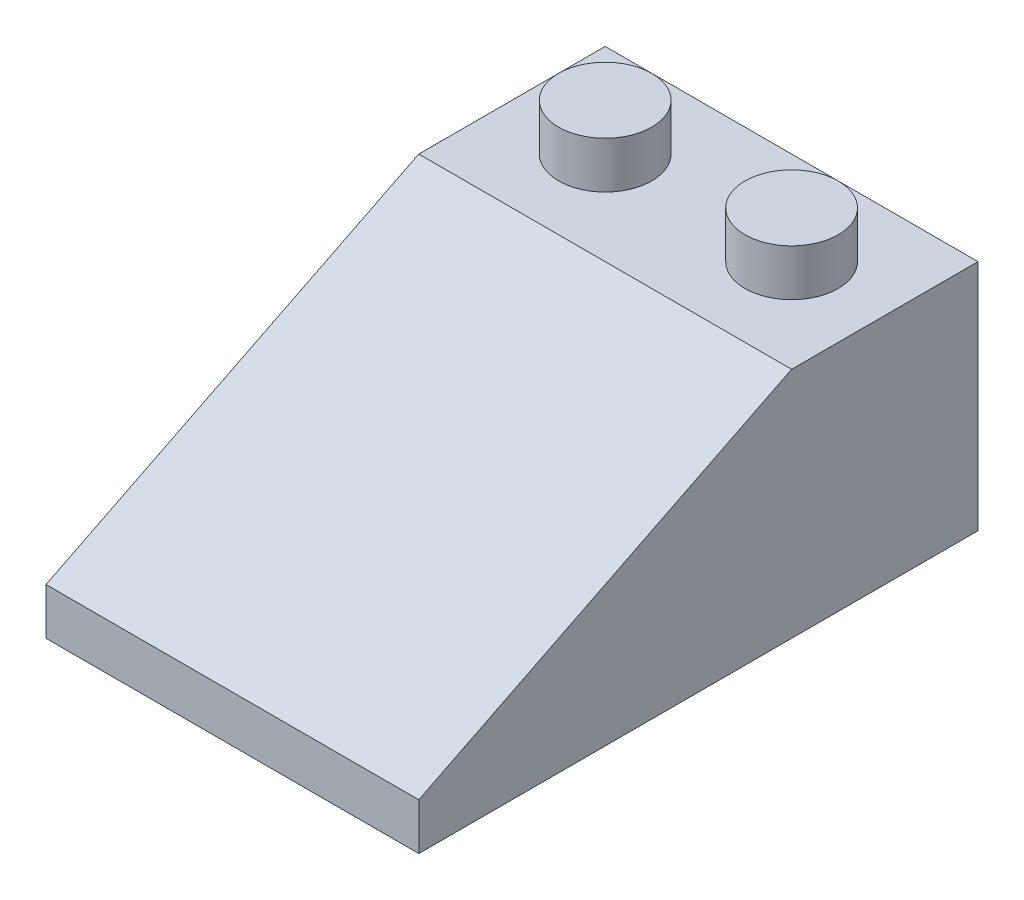
ISO-10303-21;
HEADER;
FILE_DESCRIPTION(('STEP AP214'),'2;1');
FILE_NAME('part.step','',(''),(''),'','','');
FILE_SCHEMA(('AUTOMOTIVE_DESIGN { 1 0 10303 214 1 1 1 1 }'));
ENDSEC;
DATA;
#1=APPLICATION_CONTEXT('core data for automotive mechanical design processes');
#2=APPLICATION_PROTOCOL_DEFINITION('international standard','automotive_design',2000,#1);
#3=PRODUCT_CONTEXT('',#1,'mechanical');
#4=PRODUCT('Part','Part','',(#3));
#5=PRODUCT_RELATED_PRODUCT_CATEGORY('part','',(#4));
#6=PRODUCT_DEFINITION_FORMATION('','',#4);
#7=PRODUCT_DEFINITION_CONTEXT('part definition',#1,'design');
#8=PRODUCT_DEFINITION('design','',#6,#7);
#9=PRODUCT_DEFINITION_SHAPE('','',#8);
#10=(LENGTH_UNIT() NAMED_UNIT(*) SI_UNIT(.MILLI.,.METRE.));
#11=(NAMED_UNIT(*) PLANE_ANGLE_UNIT() SI_UNIT($,.RADIAN.));
#12=(NAMED_UNIT(*) SI_UNIT($,.STERADIAN.) SOLID_ANGLE_UNIT());
#13=UNCERTAINTY_MEASURE_WITH_UNIT(LENGTH_MEASURE(1.E-05),#10,'distance_accuracy_value','');
#14=(GEOMETRIC_REPRESENTATION_CONTEXT(3) GLOBAL_UNCERTAINTY_ASSIGNED_CONTEXT((#13)) GLOBAL_UNIT_ASSIGNED_CONTEXT((#10,
#11,#12)) REPRESENTATION_CONTEXT('',''));
#15=CARTESIAN_POINT('',(0.,0.,0.));
#16=DIRECTION('',(0.,0.,1.));
#17=DIRECTION('',(1.,0.,0.));
#18=AXIS2_PLACEMENT_3D('',#15,#16,#17);
#19=CARTESIAN_POINT('',(16.,-5.,-12.));
#20=DIRECTION('',(0.,1.,0.));
#21=DIRECTION('',(0.,0.,1.));
#22=AXIS2_PLACEMENT_3D('',#19,#20,#21);
#23=PLANE('',#22);
#24=DIRECTION('',(0.,0.,-1.));
#25=VECTOR('',#24,1.);
#26=CARTESIAN_POINT('',(0.,-5.,-12.));
#27=LINE('',#26,#25);
#28=CARTESIAN_POINT('',(0.,-5.,12.));
#29=VERTEX_POINT('',#28);
#30=CARTESIAN_POINT('',(0.,-5.,-12.));
#31=VERTEX_POINT('',#30);
#32=EDGE_CURVE('E298',#29,#31,#27,.T.);
#33=ORIENTED_EDGE('',*,*,#32,.T.);
#34=DIRECTION('',(-1.,0.,0.));
#35=VECTOR('',#34,1.);
#36=CARTESIAN_POINT('',(16.,-5.,-12.));
#37=LINE('',#36,#35);
#38=CARTESIAN_POINT('',(16.,-5.,-12.));
#39=VERTEX_POINT('',#38);
#40=EDGE_CURVE('E310',#39,#31,#37,.T.);
#41=ORIENTED_EDGE('',*,*,#40,.F.);
#42=DIRECTION('',(0.,0.,-1.));
#43=VECTOR('',#42,1.);
#44=CARTESIAN_POINT('',(16.,-5.,-12.));
#45=LINE('',#44,#43);
#46=CARTESIAN_POINT('',(16.,-5.,12.));
#47=VERTEX_POINT('',#46);
#48=EDGE_CURVE('E284',#47,#39,#45,.T.);
#49=ORIENTED_EDGE('',*,*,#48,.F.);
#50=DIRECTION('',(-1.,0.,0.));
#51=VECTOR('',#50,1.);
#52=CARTESIAN_POINT('',(16.,-5.,12.));
#53=LINE('',#52,#51);
#54=EDGE_CURVE('E314',#47,#29,#53,.T.);
#55=ORIENTED_EDGE('',*,*,#54,.T.);
#56=EDGE_LOOP('',(#33,#41,#49,#55));
#57=FACE_BOUND('',#56,.T.);
#58=DIRECTION('',(0.,0.,-1.));
#59=VECTOR('',#58,1.);
#60=CARTESIAN_POINT('',(1.,-5.,-12.));
#61=LINE('',#60,#59);
#62=CARTESIAN_POINT('',(1.,-5.,11.));
#63=VERTEX_POINT('',#62);
#64=CARTESIAN_POINT('',(1.,-5.,-11.));
#65=VERTEX_POINT('',#64);
#66=EDGE_CURVE('E208',#63,#65,#61,.T.);
#67=ORIENTED_EDGE('',*,*,#66,.F.);
#68=DIRECTION('',(-1.,0.,0.));
#69=VECTOR('',#68,1.);
#70=CARTESIAN_POINT('',(16.,-5.,11.));
#71=LINE('',#70,#69);
#72=CARTESIAN_POINT('',(15.,-5.,11.));
#73=VERTEX_POINT('',#72);
#74=EDGE_CURVE('E237',#73,#63,#71,.T.);
#75=ORIENTED_EDGE('',*,*,#74,.F.);
#76=DIRECTION('',(0.,0.,-1.));
#77=VECTOR('',#76,1.);
#78=CARTESIAN_POINT('',(15.,-5.,-12.));
#79=LINE('',#78,#77);
#80=CARTESIAN_POINT('',(15.,-5.,-11.));
#81=VERTEX_POINT('',#80);
#82=EDGE_CURVE('E201',#73,#81,#79,.T.);
#83=ORIENTED_EDGE('',*,*,#82,.T.);
#84=DIRECTION('',(-1.,0.,0.));
#85=VECTOR('',#84,1.);
#86=CARTESIAN_POINT('',(16.,-5.,-11.));
#87=LINE('',#86,#85);
#88=EDGE_CURVE('E227',#81,#65,#87,.T.);
#89=ORIENTED_EDGE('',*,*,#88,.T.);
#90=EDGE_LOOP('',(#67,#75,#83,#89));
#91=FACE_BOUND('',#90,.T.);
#92=ADVANCED_FACE('F57',(#57,#91),#23,.F.);
#93=CARTESIAN_POINT('',(16.,-5.,12.));
#94=DIRECTION('',(0.,0.,-1.));
#95=DIRECTION('',(-1.,0.,0.));
#96=AXIS2_PLACEMENT_3D('',#93,#94,#95);
#97=PLANE('',#96);
#98=DIRECTION('',(0.,-1.,0.));
#99=VECTOR('',#98,1.);
#100=CARTESIAN_POINT('',(16.,-5.,12.));
#101=LINE('',#100,#99);
#102=CARTESIAN_POINT('',(16.,-3.,12.));
#103=VERTEX_POINT('',#102);
#104=EDGE_CURVE('E281',#103,#47,#101,.T.);
#105=ORIENTED_EDGE('',*,*,#104,.F.);
#106=DIRECTION('',(1.,0.,0.));
#107=VECTOR('',#106,1.);
#108=CARTESIAN_POINT('',(0.,-3.,12.));
#109=LINE('',#108,#107);
#110=CARTESIAN_POINT('',(0.,-3.,12.));
#111=VERTEX_POINT('',#110);
#112=EDGE_CURVE('E271',#111,#103,#109,.T.);
#113=ORIENTED_EDGE('',*,*,#112,.F.);
#114=DIRECTION('',(0.,-1.,0.));
#115=VECTOR('',#114,1.);
#116=CARTESIAN_POINT('',(0.,-5.,12.));
#117=LINE('',#116,#115);
#118=EDGE_CURVE('E278',#111,#29,#117,.T.);
#119=ORIENTED_EDGE('',*,*,#118,.T.);
#120=ORIENTED_EDGE('',*,*,#54,.F.);
#121=EDGE_LOOP('',(#105,#113,#119,#120));
#122=FACE_BOUND('',#121,.T.);
#123=ADVANCED_FACE('F59',(#122),#97,.F.);
#124=CARTESIAN_POINT('',(16.,-5.,-12.));
#125=DIRECTION('',(0.,0.,1.));
#126=DIRECTION('',(1.,0.,0.));
#127=AXIS2_PLACEMENT_3D('',#124,#125,#126);
#128=PLANE('',#127);
#129=DIRECTION('',(0.,1.,0.));
#130=VECTOR('',#129,1.);
#131=CARTESIAN_POINT('',(0.,-5.,-12.));
#132=LINE('',#131,#130);
#133=CARTESIAN_POINT('',(0.,5.,-12.));
#134=VERTEX_POINT('',#133);
#135=EDGE_CURVE('E301',#31,#134,#132,.T.);
#136=ORIENTED_EDGE('',*,*,#135,.T.);
#137=DIRECTION('',(-1.,0.,0.));
#138=VECTOR('',#137,1.);
#139=CARTESIAN_POINT('',(16.,5.,-12.));
#140=LINE('',#139,#138);
#141=CARTESIAN_POINT('',(16.,5.,-12.));
#142=VERTEX_POINT('',#141);
#143=EDGE_CURVE('E295',#142,#134,#140,.T.);
#144=ORIENTED_EDGE('',*,*,#143,.F.);
#145=DIRECTION('',(0.,1.,0.));
#146=VECTOR('',#145,1.);
#147=CARTESIAN_POINT('',(16.,-5.,-12.));
#148=LINE('',#147,#146);
#149=EDGE_CURVE('E288',#39,#142,#148,.T.);
#150=ORIENTED_EDGE('',*,*,#149,.F.);
#151=ORIENTED_EDGE('',*,*,#40,.T.);
#152=EDGE_LOOP('',(#136,#144,#150,#151));
#153=FACE_BOUND('',#152,.T.);
#154=ADVANCED_FACE('F331',(#153),#128,.F.);
#155=CARTESIAN_POINT('',(16.,5.,-12.));
#156=DIRECTION('',(0.,-1.,0.));
#157=DIRECTION('',(0.,0.,-1.));
#158=AXIS2_PLACEMENT_3D('',#155,#156,#157);
#159=PLANE('',#158);
#160=CARTESIAN_POINT('',(12.,5.,-8.00000000000003));
#161=DIRECTION('',(0.,-1.,0.));
#162=DIRECTION('',(0.,0.,-1.));
#163=AXIS2_PLACEMENT_3D('',#160,#161,#162);
#164=CIRCLE('',#163,2.);
#165=CARTESIAN_POINT('',(12.,5.,-10.));
#166=VERTEX_POINT('',#165);
#167=EDGE_CURVE('E66',#166,#166,#164,.F.);
#168=ORIENTED_EDGE('',*,*,#167,.F.);
#169=EDGE_LOOP('',(#168));
#170=FACE_BOUND('',#169,.T.);
#171=CARTESIAN_POINT('',(4.,5.,-8.00000000000003));
#172=DIRECTION('',(0.,-1.,0.));
#173=DIRECTION('',(0.,0.,-1.));
#174=AXIS2_PLACEMENT_3D('',#171,#172,#173);
#175=CIRCLE('',#174,2.);
#176=CARTESIAN_POINT('',(4.,5.,-10.));
#177=VERTEX_POINT('',#176);
#178=EDGE_CURVE('E318',#177,#177,#175,.F.);
#179=ORIENTED_EDGE('',*,*,#178,.F.);
#180=EDGE_LOOP('',(#179));
#181=FACE_BOUND('',#180,.T.);
#182=DIRECTION('',(0.,0.,1.));
#183=VECTOR('',#182,1.);
#184=CARTESIAN_POINT('',(0.,5.,-12.));
#185=LINE('',#184,#183);
#186=CARTESIAN_POINT('',(0.,5.00000000000001,-4.00000000000003));
#187=VERTEX_POINT('',#186);
#188=EDGE_CURVE('E285',#134,#187,#185,.T.);
#189=ORIENTED_EDGE('',*,*,#188,.T.);
#190=DIRECTION('',(1.,0.,0.));
#191=VECTOR('',#190,1.);
#192=CARTESIAN_POINT('',(0.,5.,-4.));
#193=LINE('',#192,#191);
#194=CARTESIAN_POINT('',(16.,5.,-4.));
#195=VERTEX_POINT('',#194);
#196=EDGE_CURVE('E274',#187,#195,#193,.T.);
#197=ORIENTED_EDGE('',*,*,#196,.T.);
#198=DIRECTION('',(0.,0.,1.));
#199=VECTOR('',#198,1.);
#200=CARTESIAN_POINT('',(16.,5.,-12.));
#201=LINE('',#200,#199);
#202=EDGE_CURVE('E291',#142,#195,#201,.T.);
#203=ORIENTED_EDGE('',*,*,#202,.F.);
#204=ORIENTED_EDGE('',*,*,#143,.T.);
#205=EDGE_LOOP('',(#189,#197,#203,#204));
#206=FACE_BOUND('',#205,.T.);
#207=ADVANCED_FACE('F327',(#170,#181,#206),#159,.F.);
#208=CARTESIAN_POINT('',(16.,0.,0.));
#209=DIRECTION('',(1.,0.,0.));
#210=DIRECTION('',(0.,0.,-1.));
#211=AXIS2_PLACEMENT_3D('',#208,#209,#210);
#212=PLANE('',#211);
#213=DIRECTION('',(0.,0.447213595499958,-0.894427190999916));
#214=VECTOR('',#213,1.);
#215=CARTESIAN_POINT('',(16.,2.4,1.2));
#216=LINE('',#215,#214);
#217=EDGE_CURVE('E266',#103,#195,#216,.T.);
#218=ORIENTED_EDGE('',*,*,#217,.F.);
#219=ORIENTED_EDGE('',*,*,#104,.T.);
#220=ORIENTED_EDGE('',*,*,#48,.T.);
#221=ORIENTED_EDGE('',*,*,#149,.T.);
#222=ORIENTED_EDGE('',*,*,#202,.T.);
#223=EDGE_LOOP('',(#218,#219,#220,#221,#222));
#224=FACE_BOUND('',#223,.T.);
#225=ADVANCED_FACE('F330',(#224),#212,.T.);
#226=CARTESIAN_POINT('',(0.,0.,0.));
#227=DIRECTION('',(1.,0.,0.));
#228=DIRECTION('',(0.,0.,-1.));
#229=AXIS2_PLACEMENT_3D('',#226,#227,#228);
#230=PLANE('',#229);
#231=ORIENTED_EDGE('',*,*,#118,.F.);
#232=DIRECTION('',(0.,0.447213595499958,-0.894427190999916));
#233=VECTOR('',#232,1.);
#234=CARTESIAN_POINT('',(0.,2.4,1.2));
#235=LINE('',#234,#233);
#236=EDGE_CURVE('E267',#111,#187,#235,.T.);
#237=ORIENTED_EDGE('',*,*,#236,.T.);
#238=ORIENTED_EDGE('',*,*,#188,.F.);
#239=ORIENTED_EDGE('',*,*,#135,.F.);
#240=ORIENTED_EDGE('',*,*,#32,.F.);
#241=EDGE_LOOP('',(#231,#237,#238,#239,#240));
#242=FACE_BOUND('',#241,.T.);
#243=ADVANCED_FACE('F341',(#242),#230,.F.);
#244=CARTESIAN_POINT('',(0.,2.4,1.2));
#245=DIRECTION('',(0.,-0.894427190999916,-0.447213595499958));
#246=DIRECTION('',(0.,0.447213595499958,-0.894427190999916));
#247=AXIS2_PLACEMENT_3D('',#244,#245,#246);
#248=PLANE('',#247);
#249=ORIENTED_EDGE('',*,*,#217,.T.);
#250=ORIENTED_EDGE('',*,*,#196,.F.);
#251=ORIENTED_EDGE('',*,*,#236,.F.);
#252=ORIENTED_EDGE('',*,*,#112,.T.);
#253=EDGE_LOOP('',(#249,#250,#251,#252));
#254=FACE_BOUND('',#253,.T.);
#255=ADVANCED_FACE('F345',(#254),#248,.F.);
#256=CARTESIAN_POINT('',(4.,7.,-8.00000000000003));
#257=DIRECTION('',(0.,-1.,0.));
#258=DIRECTION('',(0.,0.,-1.));
#259=AXIS2_PLACEMENT_3D('',#256,#257,#258);
#260=CYLINDRICAL_SURFACE('',#259,2.);
#261=CARTESIAN_POINT('',(4.,7.,-8.00000000000003));
#262=DIRECTION('',(0.,1.,0.));
#263=DIRECTION('',(0.,0.,1.));
#264=AXIS2_PLACEMENT_3D('',#261,#262,#263);
#265=CIRCLE('',#264,2.);
#266=CARTESIAN_POINT('',(4.,7.,-6.00000000000003));
#267=VERTEX_POINT('',#266);
#268=EDGE_CURVE('E262',#267,#267,#265,.T.);
#269=ORIENTED_EDGE('',*,*,#268,.F.);
#270=EDGE_LOOP('',(#269));
#271=FACE_BOUND('',#270,.T.);
#272=ORIENTED_EDGE('',*,*,#178,.T.);
#273=EDGE_LOOP('',(#272));
#274=FACE_BOUND('',#273,.T.);
#275=ADVANCED_FACE('F552',(#271,#274),#260,.T.);
#276=CARTESIAN_POINT('',(4.,7.,-8.00000000000003));
#277=DIRECTION('',(0.,1.,0.));
#278=DIRECTION('',(0.,0.,1.));
#279=AXIS2_PLACEMENT_3D('',#276,#277,#278);
#280=PLANE('',#279);
#281=ORIENTED_EDGE('',*,*,#268,.T.);
#282=EDGE_LOOP('',(#281));
#283=FACE_BOUND('',#282,.T.);
#284=ADVANCED_FACE('F546',(#283),#280,.T.);
#285=CARTESIAN_POINT('',(12.,7.,-8.00000000000003));
#286=DIRECTION('',(0.,-1.,0.));
#287=DIRECTION('',(0.,0.,-1.));
#288=AXIS2_PLACEMENT_3D('',#285,#286,#287);
#289=CYLINDRICAL_SURFACE('',#288,2.);
#290=CARTESIAN_POINT('',(12.,7.,-8.00000000000003));
#291=DIRECTION('',(0.,1.,0.));
#292=DIRECTION('',(0.,0.,-1.));
#293=AXIS2_PLACEMENT_3D('',#290,#291,#292);
#294=CIRCLE('',#293,2.);
#295=CARTESIAN_POINT('',(12.,7.,-10.));
#296=VERTEX_POINT('',#295);
#297=EDGE_CURVE('E232',#296,#296,#294,.T.);
#298=ORIENTED_EDGE('',*,*,#297,.F.);
#299=EDGE_LOOP('',(#298));
#300=FACE_BOUND('',#299,.T.);
#301=ORIENTED_EDGE('',*,*,#167,.T.);
#302=EDGE_LOOP('',(#301));
#303=FACE_BOUND('',#302,.T.);
#304=ADVANCED_FACE('F325',(#300,#303),#289,.T.);
#305=CARTESIAN_POINT('',(12.,7.,-8.00000000000003));
#306=DIRECTION('',(0.,-1.,0.));
#307=DIRECTION('',(0.,0.,-1.));
#308=AXIS2_PLACEMENT_3D('',#305,#306,#307);
#309=PLANE('',#308);
#310=ORIENTED_EDGE('',*,*,#297,.T.);
#311=EDGE_LOOP('',(#310));
#312=FACE_BOUND('',#311,.T.);
#313=ADVANCED_FACE('F371',(#312),#309,.F.);
#314=CARTESIAN_POINT('',(16.,-5.,11.));
#315=DIRECTION('',(0.,0.,-1.));
#316=DIRECTION('',(-1.,0.,0.));
#317=AXIS2_PLACEMENT_3D('',#314,#315,#316);
#318=PLANE('',#317);
#319=DIRECTION('',(0.,-1.,0.));
#320=VECTOR('',#319,1.);
#321=CARTESIAN_POINT('',(15.,-5.,11.));
#322=LINE('',#321,#320);
#323=CARTESIAN_POINT('',(15.,-3.6180339887499,11.));
#324=VERTEX_POINT('',#323);
#325=EDGE_CURVE('E197',#324,#73,#322,.T.);
#326=ORIENTED_EDGE('',*,*,#325,.T.);
#327=ORIENTED_EDGE('',*,*,#74,.T.);
#328=DIRECTION('',(0.,-1.,0.));
#329=VECTOR('',#328,1.);
#330=CARTESIAN_POINT('',(1.,-5.,11.));
#331=LINE('',#330,#329);
#332=CARTESIAN_POINT('',(1.,-3.6180339887499,11.));
#333=VERTEX_POINT('',#332);
#334=EDGE_CURVE('E155',#333,#63,#331,.T.);
#335=ORIENTED_EDGE('',*,*,#334,.F.);
#336=DIRECTION('',(1.,0.,0.));
#337=VECTOR('',#336,1.);
#338=CARTESIAN_POINT('',(0.,-3.6180339887499,11.));
#339=LINE('',#338,#337);
#340=EDGE_CURVE('E203',#333,#324,#339,.T.);
#341=ORIENTED_EDGE('',*,*,#340,.T.);
#342=EDGE_LOOP('',(#326,#327,#335,#341));
#343=FACE_BOUND('',#342,.T.);
#344=ADVANCED_FACE('F375',(#343),#318,.T.);
#345=CARTESIAN_POINT('',(16.,-5.,-11.));
#346=DIRECTION('',(0.,0.,1.));
#347=DIRECTION('',(1.,0.,0.));
#348=AXIS2_PLACEMENT_3D('',#345,#346,#347);
#349=PLANE('',#348);
#350=DIRECTION('',(0.,1.,0.));
#351=VECTOR('',#350,1.);
#352=CARTESIAN_POINT('',(1.,-5.,-11.));
#353=LINE('',#352,#351);
#354=CARTESIAN_POINT('',(1.,4.,-11.));
#355=VERTEX_POINT('',#354);
#356=EDGE_CURVE('E221',#65,#355,#353,.T.);
#357=ORIENTED_EDGE('',*,*,#356,.F.);
#358=ORIENTED_EDGE('',*,*,#88,.F.);
#359=DIRECTION('',(0.,1.,0.));
#360=VECTOR('',#359,1.);
#361=CARTESIAN_POINT('',(15.,-5.,-11.));
#362=LINE('',#361,#360);
#363=CARTESIAN_POINT('',(15.,4.,-11.));
#364=VERTEX_POINT('',#363);
#365=EDGE_CURVE('E214',#81,#364,#362,.T.);
#366=ORIENTED_EDGE('',*,*,#365,.T.);
#367=DIRECTION('',(-1.,0.,0.));
#368=VECTOR('',#367,1.);
#369=CARTESIAN_POINT('',(16.,4.,-11.));
#370=LINE('',#369,#368);
#371=EDGE_CURVE('E220',#364,#355,#370,.T.);
#372=ORIENTED_EDGE('',*,*,#371,.T.);
#373=EDGE_LOOP('',(#357,#358,#366,#372));
#374=FACE_BOUND('',#373,.T.);
#375=ADVANCED_FACE('F379',(#374),#349,.T.);
#376=CARTESIAN_POINT('',(16.,4.,-12.));
#377=DIRECTION('',(0.,-1.,0.));
#378=DIRECTION('',(0.,0.,-1.));
#379=AXIS2_PLACEMENT_3D('',#376,#377,#378);
#380=PLANE('',#379);
#381=CARTESIAN_POINT('',(8.,4.,-4.));
#382=DIRECTION('',(0.,-1.,0.));
#383=DIRECTION('',(0.,0.,-1.));
#384=AXIS2_PLACEMENT_3D('',#381,#382,#383);
#385=CIRCLE('',#384,2.7);
#386=CARTESIAN_POINT('',(10.6896601848559,4.,-4.23606797749979));
#387=VERTEX_POINT('',#386);
#388=CARTESIAN_POINT('',(5.31033981514408,4.,-4.23606797749979));
#389=VERTEX_POINT('',#388);
#390=EDGE_CURVE('E160',#387,#389,#385,.F.);
#391=ORIENTED_EDGE('',*,*,#390,.T.);
#392=DIRECTION('',(1.,0.,0.));
#393=VECTOR('',#392,1.);
#394=CARTESIAN_POINT('',(16.,4.,-4.23606797749979));
#395=LINE('',#394,#393);
#396=CARTESIAN_POINT('',(1.,4.,-4.23606797749979));
#397=VERTEX_POINT('',#396);
#398=EDGE_CURVE('E145',#397,#389,#395,.T.);
#399=ORIENTED_EDGE('',*,*,#398,.F.);
#400=DIRECTION('',(0.,0.,1.));
#401=VECTOR('',#400,1.);
#402=CARTESIAN_POINT('',(1.,4.,-12.));
#403=LINE('',#402,#401);
#404=EDGE_CURVE('E202',#355,#397,#403,.T.);
#405=ORIENTED_EDGE('',*,*,#404,.F.);
#406=ORIENTED_EDGE('',*,*,#371,.F.);
#407=DIRECTION('',(0.,0.,1.));
#408=VECTOR('',#407,1.);
#409=CARTESIAN_POINT('',(15.,4.,-12.));
#410=LINE('',#409,#408);
#411=CARTESIAN_POINT('',(15.,4.,-4.23606797749979));
#412=VERTEX_POINT('',#411);
#413=EDGE_CURVE('E217',#364,#412,#410,.T.);
#414=ORIENTED_EDGE('',*,*,#413,.T.);
#415=EDGE_CURVE('E158',#387,#412,#395,.T.);
#416=ORIENTED_EDGE('',*,*,#415,.F.);
#417=EDGE_LOOP('',(#391,#399,#405,#406,#414,#416));
#418=FACE_BOUND('',#417,.T.);
#419=CARTESIAN_POINT('',(12.,4.,-8.00000000000003));
#420=DIRECTION('',(0.,-1.,0.));
#421=DIRECTION('',(0.,0.,-1.));
#422=AXIS2_PLACEMENT_3D('',#419,#420,#421);
#423=CIRCLE('',#422,1.);
#424=CARTESIAN_POINT('',(12.,4.,-9.00000000000003));
#425=VERTEX_POINT('',#424);
#426=EDGE_CURVE('E228',#425,#425,#423,.F.);
#427=ORIENTED_EDGE('',*,*,#426,.T.);
#428=EDGE_LOOP('',(#427));
#429=FACE_BOUND('',#428,.T.);
#430=CARTESIAN_POINT('',(4.,4.,-8.00000000000003));
#431=DIRECTION('',(0.,-1.,0.));
#432=DIRECTION('',(0.,0.,-1.));
#433=AXIS2_PLACEMENT_3D('',#430,#431,#432);
#434=CIRCLE('',#433,1.);
#435=CARTESIAN_POINT('',(4.,4.,-9.00000000000003));
#436=VERTEX_POINT('',#435);
#437=EDGE_CURVE('E233',#436,#436,#434,.F.);
#438=ORIENTED_EDGE('',*,*,#437,.T.);
#439=EDGE_LOOP('',(#438));
#440=FACE_BOUND('',#439,.T.);
#441=ADVANCED_FACE('F161',(#418,#429,#440),#380,.T.);
#442=CARTESIAN_POINT('',(15.,0.,0.));
#443=DIRECTION('',(1.,0.,0.));
#444=DIRECTION('',(0.,0.,-1.));
#445=AXIS2_PLACEMENT_3D('',#442,#443,#444);
#446=PLANE('',#445);
#447=DIRECTION('',(0.,0.447213595499958,-0.894427190999916));
#448=VECTOR('',#447,1.);
#449=CARTESIAN_POINT('',(15.,1.50557280900008,0.752786404500042));
#450=LINE('',#449,#448);
#451=EDGE_CURVE('E209',#324,#412,#450,.T.);
#452=ORIENTED_EDGE('',*,*,#451,.T.);
#453=ORIENTED_EDGE('',*,*,#413,.F.);
#454=ORIENTED_EDGE('',*,*,#365,.F.);
#455=ORIENTED_EDGE('',*,*,#82,.F.);
#456=ORIENTED_EDGE('',*,*,#325,.F.);
#457=EDGE_LOOP('',(#452,#453,#454,#455,#456));
#458=FACE_BOUND('',#457,.T.);
#459=ADVANCED_FACE('F393',(#458),#446,.F.);
#460=CARTESIAN_POINT('',(1.,0.,0.));
#461=DIRECTION('',(1.,0.,0.));
#462=DIRECTION('',(0.,0.,-1.));
#463=AXIS2_PLACEMENT_3D('',#460,#461,#462);
#464=PLANE('',#463);
#465=ORIENTED_EDGE('',*,*,#334,.T.);
#466=ORIENTED_EDGE('',*,*,#66,.T.);
#467=ORIENTED_EDGE('',*,*,#356,.T.);
#468=ORIENTED_EDGE('',*,*,#404,.T.);
#469=DIRECTION('',(0.,0.447213595499958,-0.894427190999916));
#470=VECTOR('',#469,1.);
#471=CARTESIAN_POINT('',(1.,1.50557280900008,0.752786404500042));
#472=LINE('',#471,#470);
#473=EDGE_CURVE('E150',#333,#397,#472,.T.);
#474=ORIENTED_EDGE('',*,*,#473,.F.);
#475=EDGE_LOOP('',(#465,#466,#467,#468,#474));
#476=FACE_BOUND('',#475,.T.);
#477=ADVANCED_FACE('F397',(#476),#464,.T.);
#478=CARTESIAN_POINT('',(0.,1.50557280900008,0.752786404500042));
#479=DIRECTION('',(0.,-0.894427190999916,-0.447213595499958));
#480=DIRECTION('',(0.,0.447213595499958,-0.894427190999916));
#481=AXIS2_PLACEMENT_3D('',#478,#479,#480);
#482=PLANE('',#481);
#483=CARTESIAN_POINT('',(8.,3.8819660112501,-4.));
#484=DIRECTION('',(0.,-0.894427190999916,-0.447213595499958));
#485=DIRECTION('',(0.,-0.447213595499958,0.894427190999916));
#486=AXIS2_PLACEMENT_3D('',#483,#484,#485);
#487=ELLIPSE('',#486,3.01869176962472,2.7);
#488=EDGE_CURVE('E73',#389,#387,#487,.F.);
#489=ORIENTED_EDGE('',*,*,#488,.T.);
#490=ORIENTED_EDGE('',*,*,#415,.T.);
#491=ORIENTED_EDGE('',*,*,#451,.F.);
#492=ORIENTED_EDGE('',*,*,#340,.F.);
#493=ORIENTED_EDGE('',*,*,#473,.T.);
#494=ORIENTED_EDGE('',*,*,#398,.T.);
#495=EDGE_LOOP('',(#489,#490,#491,#492,#493,#494));
#496=FACE_BOUND('',#495,.T.);
#497=CARTESIAN_POINT('',(8.,-0.118033988749894,4.));
#498=DIRECTION('',(0.,-0.894427190999916,-0.447213595499958));
#499=DIRECTION('',(0.,-0.447213595499958,0.894427190999916));
#500=AXIS2_PLACEMENT_3D('',#497,#498,#499);
#501=ELLIPSE('',#500,3.01869176962472,2.7);
#502=CARTESIAN_POINT('',(8.,-1.4680339887499,6.7));
#503=VERTEX_POINT('',#502);
#504=EDGE_CURVE('E12',#503,#503,#501,.T.);
#505=ORIENTED_EDGE('',*,*,#504,.F.);
#506=EDGE_LOOP('',(#505));
#507=FACE_BOUND('',#506,.T.);
#508=ADVANCED_FACE('F147',(#496,#507),#482,.T.);
#509=CARTESIAN_POINT('',(4.,7.,-8.00000000000003));
#510=DIRECTION('',(0.,-1.,0.));
#511=DIRECTION('',(0.,0.,-1.));
#512=AXIS2_PLACEMENT_3D('',#509,#510,#511);
#513=CYLINDRICAL_SURFACE('',#512,1.);
#514=CARTESIAN_POINT('',(4.,6.,-8.00000000000003));
#515=DIRECTION('',(0.,1.,0.));
#516=DIRECTION('',(0.,0.,1.));
#517=AXIS2_PLACEMENT_3D('',#514,#515,#516);
#518=CIRCLE('',#517,1.);
#519=CARTESIAN_POINT('',(4.,6.,-7.00000000000003));
#520=VERTEX_POINT('',#519);
#521=EDGE_CURVE('E213',#520,#520,#518,.T.);
#522=ORIENTED_EDGE('',*,*,#521,.T.);
#523=EDGE_LOOP('',(#522));
#524=FACE_BOUND('',#523,.T.);
#525=ORIENTED_EDGE('',*,*,#437,.F.);
#526=EDGE_LOOP('',(#525));
#527=FACE_BOUND('',#526,.T.);
#528=ADVANCED_FACE('F412',(#524,#527),#513,.F.);
#529=CARTESIAN_POINT('',(4.,6.,-8.00000000000003));
#530=DIRECTION('',(0.,1.,0.));
#531=DIRECTION('',(0.,0.,1.));
#532=AXIS2_PLACEMENT_3D('',#529,#530,#531);
#533=PLANE('',#532);
#534=ORIENTED_EDGE('',*,*,#521,.F.);
#535=EDGE_LOOP('',(#534));
#536=FACE_BOUND('',#535,.T.);
#537=ADVANCED_FACE('F416',(#536),#533,.F.);
#538=CARTESIAN_POINT('',(12.,7.,-8.00000000000003));
#539=DIRECTION('',(0.,-1.,0.));
#540=DIRECTION('',(0.,0.,-1.));
#541=AXIS2_PLACEMENT_3D('',#538,#539,#540);
#542=CYLINDRICAL_SURFACE('',#541,1.);
#543=CARTESIAN_POINT('',(12.,6.,-8.00000000000003));
#544=DIRECTION('',(0.,-1.,0.));
#545=DIRECTION('',(0.,0.,-1.));
#546=AXIS2_PLACEMENT_3D('',#543,#544,#545);
#547=CIRCLE('',#546,1.);
#548=CARTESIAN_POINT('',(12.,6.,-9.00000000000003));
#549=VERTEX_POINT('',#548);
#550=EDGE_CURVE('E196',#549,#549,#547,.F.);
#551=ORIENTED_EDGE('',*,*,#550,.T.);
#552=EDGE_LOOP('',(#551));
#553=FACE_BOUND('',#552,.T.);
#554=ORIENTED_EDGE('',*,*,#426,.F.);
#555=EDGE_LOOP('',(#554));
#556=FACE_BOUND('',#555,.T.);
#557=ADVANCED_FACE('F425',(#553,#556),#542,.F.);
#558=CARTESIAN_POINT('',(12.,6.,-8.00000000000003));
#559=DIRECTION('',(0.,-1.,0.));
#560=DIRECTION('',(0.,0.,-1.));
#561=AXIS2_PLACEMENT_3D('',#558,#559,#560);
#562=PLANE('',#561);
#563=ORIENTED_EDGE('',*,*,#550,.F.);
#564=EDGE_LOOP('',(#563));
#565=FACE_BOUND('',#564,.T.);
#566=ADVANCED_FACE('F434',(#565),#562,.T.);
#567=CARTESIAN_POINT('',(8.,-5.,4.));
#568=DIRECTION('',(0.,-1.,0.));
#569=DIRECTION('',(0.,0.,-1.));
#570=AXIS2_PLACEMENT_3D('',#567,#568,#569);
#571=PLANE('',#570);
#572=CARTESIAN_POINT('',(8.,-5.,4.));
#573=DIRECTION('',(0.,-1.,0.));
#574=DIRECTION('',(0.,0.,-1.));
#575=AXIS2_PLACEMENT_3D('',#572,#573,#574);
#576=CIRCLE('',#575,1.7);
#577=CARTESIAN_POINT('',(8.,-5.,2.3));
#578=VERTEX_POINT('',#577);
#579=EDGE_CURVE('E185',#578,#578,#576,.T.);
#580=ORIENTED_EDGE('',*,*,#579,.F.);
#581=EDGE_LOOP('',(#580));
#582=FACE_BOUND('',#581,.T.);
#583=CARTESIAN_POINT('',(8.,-5.,4.));
#584=DIRECTION('',(0.,-1.,0.));
#585=DIRECTION('',(0.,0.,-1.));
#586=AXIS2_PLACEMENT_3D('',#583,#584,#585);
#587=CIRCLE('',#586,2.7);
#588=CARTESIAN_POINT('',(8.,-5.,1.29999999999999));
#589=VERTEX_POINT('',#588);
#590=EDGE_CURVE('E180',#589,#589,#587,.T.);
#591=ORIENTED_EDGE('',*,*,#590,.T.);
#592=EDGE_LOOP('',(#591));
#593=FACE_BOUND('',#592,.T.);
#594=ADVANCED_FACE('F443',(#582,#593),#571,.T.);
#595=CARTESIAN_POINT('',(8.,7.002,4.));
#596=DIRECTION('',(0.,-1.,0.));
#597=DIRECTION('',(0.,0.,-1.));
#598=AXIS2_PLACEMENT_3D('',#595,#596,#597);
#599=CYLINDRICAL_SURFACE('',#598,2.7);
#600=ORIENTED_EDGE('',*,*,#504,.T.);
#601=EDGE_LOOP('',(#600));
#602=FACE_BOUND('',#601,.T.);
#603=ORIENTED_EDGE('',*,*,#590,.F.);
#604=EDGE_LOOP('',(#603));
#605=FACE_BOUND('',#604,.T.);
#606=ADVANCED_FACE('F469',(#602,#605),#599,.T.);
#607=CARTESIAN_POINT('',(8.,7.002,4.));
#608=DIRECTION('',(0.,-1.,0.));
#609=DIRECTION('',(0.,0.,-1.));
#610=AXIS2_PLACEMENT_3D('',#607,#608,#609);
#611=CYLINDRICAL_SURFACE('',#610,1.7);
#612=CARTESIAN_POINT('',(8.,-0.118033988749894,4.));
#613=DIRECTION('',(0.,-0.894427190999916,-0.447213595499958));
#614=DIRECTION('',(0.,-0.447213595499958,0.894427190999916));
#615=AXIS2_PLACEMENT_3D('',#612,#613,#614);
#616=ELLIPSE('',#615,1.90065778087482,1.7);
#617=CARTESIAN_POINT('',(8.,-0.968033988749895,5.7));
#618=VERTEX_POINT('',#617);
#619=EDGE_CURVE('E189',#618,#618,#616,.F.);
#620=ORIENTED_EDGE('',*,*,#619,.T.);
#621=EDGE_LOOP('',(#620));
#622=FACE_BOUND('',#621,.T.);
#623=ORIENTED_EDGE('',*,*,#579,.T.);
#624=EDGE_LOOP('',(#623));
#625=FACE_BOUND('',#624,.T.);
#626=ADVANCED_FACE('F446',(#622,#625),#611,.F.);
#627=ORIENTED_EDGE('',*,*,#619,.F.);
#628=EDGE_LOOP('',(#627));
#629=FACE_BOUND('',#628,.T.);
#630=ADVANCED_FACE('F462',(#629),#482,.T.);
#631=CARTESIAN_POINT('',(8.,-5.,-4.));
#632=DIRECTION('',(0.,1.,0.));
#633=DIRECTION('',(0.,0.,1.));
#634=AXIS2_PLACEMENT_3D('',#631,#632,#633);
#635=PLANE('',#634);
#636=CARTESIAN_POINT('',(8.,-5.,-4.));
#637=DIRECTION('',(0.,-1.,0.));
#638=DIRECTION('',(0.,0.,1.));
#639=AXIS2_PLACEMENT_3D('',#636,#637,#638);
#640=CIRCLE('',#639,1.7);
#641=CARTESIAN_POINT('',(8.,-5.,-2.3));
#642=VERTEX_POINT('',#641);
#643=EDGE_CURVE('E181',#642,#642,#640,.T.);
#644=ORIENTED_EDGE('',*,*,#643,.F.);
#645=EDGE_LOOP('',(#644));
#646=FACE_BOUND('',#645,.T.);
#647=CARTESIAN_POINT('',(8.,-5.,-4.));
#648=DIRECTION('',(0.,-1.,0.));
#649=DIRECTION('',(0.,0.,1.));
#650=AXIS2_PLACEMENT_3D('',#647,#648,#649);
#651=CIRCLE('',#650,2.7);
#652=CARTESIAN_POINT('',(8.,-5.,-1.3));
#653=VERTEX_POINT('',#652);
#654=EDGE_CURVE('E176',#653,#653,#651,.T.);
#655=ORIENTED_EDGE('',*,*,#654,.T.);
#656=EDGE_LOOP('',(#655));
#657=FACE_BOUND('',#656,.T.);
#658=ADVANCED_FACE('F496',(#646,#657),#635,.F.);
#659=CARTESIAN_POINT('',(8.,7.002,-4.));
#660=DIRECTION('',(0.,-1.,0.));
#661=DIRECTION('',(0.,0.,-1.));
#662=AXIS2_PLACEMENT_3D('',#659,#660,#661);
#663=CYLINDRICAL_SURFACE('',#662,2.7);
#664=ORIENTED_EDGE('',*,*,#488,.F.);
#665=ORIENTED_EDGE('',*,*,#390,.F.);
#666=EDGE_LOOP('',(#664,#665));
#667=FACE_BOUND('',#666,.T.);
#668=ORIENTED_EDGE('',*,*,#654,.F.);
#669=EDGE_LOOP('',(#668));
#670=FACE_BOUND('',#669,.T.);
#671=ADVANCED_FACE('F167',(#667,#670),#663,.T.);
#672=CARTESIAN_POINT('',(8.,7.002,-4.));
#673=DIRECTION('',(0.,-1.,0.));
#674=DIRECTION('',(0.,0.,-1.));
#675=AXIS2_PLACEMENT_3D('',#672,#673,#674);
#676=CYLINDRICAL_SURFACE('',#675,1.7);
#677=CARTESIAN_POINT('',(8.,4.,-4.));
#678=DIRECTION('',(0.,-1.,0.));
#679=DIRECTION('',(0.,0.,-1.));
#680=AXIS2_PLACEMENT_3D('',#677,#678,#679);
#681=CIRCLE('',#680,1.7);
#682=CARTESIAN_POINT('',(9.68352959878915,4.,-4.23606797749979));
#683=VERTEX_POINT('',#682);
#684=CARTESIAN_POINT('',(6.31647040121085,4.,-4.23606797749979));
#685=VERTEX_POINT('',#684);
#686=EDGE_CURVE('E80',#683,#685,#681,.F.);
#687=ORIENTED_EDGE('',*,*,#686,.T.);
#688=CARTESIAN_POINT('',(8.,3.8819660112501,-4.));
#689=DIRECTION('',(0.,-0.894427190999916,-0.447213595499958));
#690=DIRECTION('',(0.,-0.447213595499958,0.894427190999916));
#691=AXIS2_PLACEMENT_3D('',#688,#689,#690);
#692=ELLIPSE('',#691,1.90065778087482,1.7);
#693=EDGE_CURVE('E170',#685,#683,#692,.F.);
#694=ORIENTED_EDGE('',*,*,#693,.T.);
#695=EDGE_LOOP('',(#687,#694));
#696=FACE_BOUND('',#695,.T.);
#697=ORIENTED_EDGE('',*,*,#643,.T.);
#698=EDGE_LOOP('',(#697));
#699=FACE_BOUND('',#698,.T.);
#700=ADVANCED_FACE('F498',(#696,#699),#676,.F.);
#701=EDGE_CURVE('E156',#685,#683,#395,.T.);
#702=ORIENTED_EDGE('',*,*,#701,.T.);
#703=ORIENTED_EDGE('',*,*,#693,.F.);
#704=EDGE_LOOP('',(#702,#703));
#705=FACE_BOUND('',#704,.T.);
#706=ADVANCED_FACE('F461',(#705),#482,.T.);
#707=ORIENTED_EDGE('',*,*,#701,.F.);
#708=ORIENTED_EDGE('',*,*,#686,.F.);
#709=EDGE_LOOP('',(#707,#708));
#710=FACE_BOUND('',#709,.T.);
#711=ADVANCED_FACE('F454',(#710),#380,.T.);
#712=CLOSED_SHELL('',(#92,#123,#154,#207,#225,#243,#255,#275,#284,#304,#313,#344,#375,#441,#459,
#477,#508,#528,#537,#557,#566,#594,#606,#626,#630,#658,#671,#700,#706,#711));
#713=MANIFOLD_SOLID_BREP('B2',#712);
#714=ADVANCED_BREP_SHAPE_REPRESENTATION('',(#18,#713),#14);
#715=SHAPE_DEFINITION_REPRESENTATION(#9,#714);
ENDSEC;
END-ISO-10303-21;
